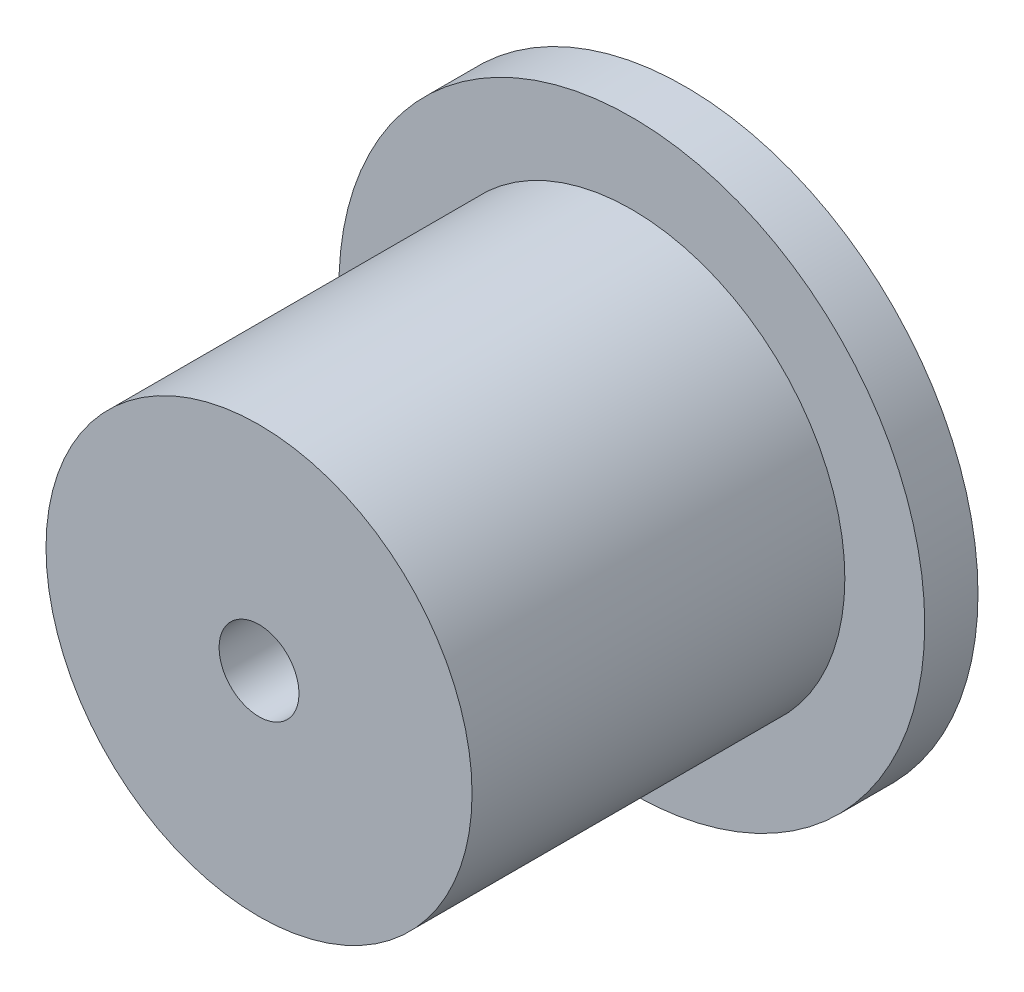
ISO-10303-21;
HEADER;
FILE_DESCRIPTION(('STEP AP214'),'2;1');
FILE_NAME('part.step','',(''),(''),'','','');
FILE_SCHEMA(('AUTOMOTIVE_DESIGN { 1 0 10303 214 1 1 1 1 }'));
ENDSEC;
DATA;
#1=APPLICATION_CONTEXT('core data for automotive mechanical design processes');
#2=APPLICATION_PROTOCOL_DEFINITION('international standard','automotive_design',2000,#1);
#3=PRODUCT_CONTEXT('',#1,'mechanical');
#4=PRODUCT('Part','Part','',(#3));
#5=PRODUCT_RELATED_PRODUCT_CATEGORY('part','',(#4));
#6=PRODUCT_DEFINITION_FORMATION('','',#4);
#7=PRODUCT_DEFINITION_CONTEXT('part definition',#1,'design');
#8=PRODUCT_DEFINITION('design','',#6,#7);
#9=PRODUCT_DEFINITION_SHAPE('','',#8);
#10=(LENGTH_UNIT() NAMED_UNIT(*) SI_UNIT(.MILLI.,.METRE.));
#11=(NAMED_UNIT(*) PLANE_ANGLE_UNIT() SI_UNIT($,.RADIAN.));
#12=(NAMED_UNIT(*) SI_UNIT($,.STERADIAN.) SOLID_ANGLE_UNIT());
#13=UNCERTAINTY_MEASURE_WITH_UNIT(LENGTH_MEASURE(1.E-05),#10,'distance_accuracy_value','');
#14=(GEOMETRIC_REPRESENTATION_CONTEXT(3) GLOBAL_UNCERTAINTY_ASSIGNED_CONTEXT((#13)) GLOBAL_UNIT_ASSIGNED_CONTEXT((#10,
#11,#12)) REPRESENTATION_CONTEXT('',''));
#15=CARTESIAN_POINT('',(0.,0.,0.));
#16=DIRECTION('',(0.,0.,1.));
#17=DIRECTION('',(1.,0.,0.));
#18=AXIS2_PLACEMENT_3D('',#15,#16,#17);
#19=CARTESIAN_POINT('',(0.,0.,2.));
#20=DIRECTION('',(0.,0.,-1.));
#21=DIRECTION('',(-1.,0.,0.));
#22=AXIS2_PLACEMENT_3D('',#19,#20,#21);
#23=CYLINDRICAL_SURFACE('',#22,11.);
#24=CARTESIAN_POINT('',(0.,0.,2.));
#25=DIRECTION('',(0.,0.,1.));
#26=DIRECTION('',(1.,0.,0.));
#27=AXIS2_PLACEMENT_3D('',#24,#25,#26);
#28=CIRCLE('',#27,11.);
#29=CARTESIAN_POINT('',(11.,0.,2.));
#30=VERTEX_POINT('',#29);
#31=EDGE_CURVE('E46',#30,#30,#28,.T.);
#32=ORIENTED_EDGE('',*,*,#31,.F.);
#33=EDGE_LOOP('',(#32));
#34=FACE_BOUND('',#33,.T.);
#35=CARTESIAN_POINT('',(0.,0.,0.));
#36=DIRECTION('',(0.,0.,1.));
#37=DIRECTION('',(1.,0.,0.));
#38=AXIS2_PLACEMENT_3D('',#35,#36,#37);
#39=CIRCLE('',#38,11.);
#40=CARTESIAN_POINT('',(11.,0.,0.));
#41=VERTEX_POINT('',#40);
#42=EDGE_CURVE('E42',#41,#41,#39,.T.);
#43=ORIENTED_EDGE('',*,*,#42,.T.);
#44=EDGE_LOOP('',(#43));
#45=FACE_BOUND('',#44,.T.);
#46=ADVANCED_FACE('F39',(#34,#45),#23,.T.);
#47=CARTESIAN_POINT('',(0.,0.,2.));
#48=DIRECTION('',(0.,0.,1.));
#49=DIRECTION('',(1.,0.,0.));
#50=AXIS2_PLACEMENT_3D('',#47,#48,#49);
#51=PLANE('',#50);
#52=CARTESIAN_POINT('',(0.,0.,2.));
#53=DIRECTION('',(0.,0.,1.));
#54=DIRECTION('',(1.,0.,0.));
#55=AXIS2_PLACEMENT_3D('',#52,#53,#54);
#56=CIRCLE('',#55,8.);
#57=CARTESIAN_POINT('',(8.,0.,2.));
#58=VERTEX_POINT('',#57);
#59=EDGE_CURVE('E10',#58,#58,#56,.T.);
#60=ORIENTED_EDGE('',*,*,#59,.F.);
#61=EDGE_LOOP('',(#60));
#62=FACE_BOUND('',#61,.T.);
#63=ORIENTED_EDGE('',*,*,#31,.T.);
#64=EDGE_LOOP('',(#63));
#65=FACE_BOUND('',#64,.T.);
#66=ADVANCED_FACE('F74',(#62,#65),#51,.T.);
#67=CARTESIAN_POINT('',(0.,0.,0.));
#68=DIRECTION('',(0.,0.,1.));
#69=DIRECTION('',(1.,0.,0.));
#70=AXIS2_PLACEMENT_3D('',#67,#68,#69);
#71=PLANE('',#70);
#72=CARTESIAN_POINT('',(0.,0.,0.));
#73=DIRECTION('',(0.,0.,-1.));
#74=DIRECTION('',(-1.,0.,0.));
#75=AXIS2_PLACEMENT_3D('',#72,#73,#74);
#76=CIRCLE('',#75,3.);
#77=CARTESIAN_POINT('',(-3.,0.,0.));
#78=VERTEX_POINT('',#77);
#79=EDGE_CURVE('E64',#78,#78,#76,.T.);
#80=ORIENTED_EDGE('',*,*,#79,.F.);
#81=EDGE_LOOP('',(#80));
#82=FACE_BOUND('',#81,.T.);
#83=ORIENTED_EDGE('',*,*,#42,.F.);
#84=EDGE_LOOP('',(#83));
#85=FACE_BOUND('',#84,.T.);
#86=ADVANCED_FACE('F70',(#82,#85),#71,.F.);
#87=CARTESIAN_POINT('',(0.,0.,16.));
#88=DIRECTION('',(0.,0.,-1.));
#89=DIRECTION('',(-1.,0.,0.));
#90=AXIS2_PLACEMENT_3D('',#87,#88,#89);
#91=CYLINDRICAL_SURFACE('',#90,8.);
#92=CARTESIAN_POINT('',(0.,0.,16.));
#93=DIRECTION('',(0.,0.,1.));
#94=DIRECTION('',(1.,0.,0.));
#95=AXIS2_PLACEMENT_3D('',#92,#93,#94);
#96=CIRCLE('',#95,8.);
#97=CARTESIAN_POINT('',(8.,0.,16.));
#98=VERTEX_POINT('',#97);
#99=EDGE_CURVE('E52',#98,#98,#96,.T.);
#100=ORIENTED_EDGE('',*,*,#99,.F.);
#101=EDGE_LOOP('',(#100));
#102=FACE_BOUND('',#101,.T.);
#103=ORIENTED_EDGE('',*,*,#59,.T.);
#104=EDGE_LOOP('',(#103));
#105=FACE_BOUND('',#104,.T.);
#106=ADVANCED_FACE('F73',(#102,#105),#91,.T.);
#107=CARTESIAN_POINT('',(0.,0.,16.));
#108=DIRECTION('',(0.,0.,1.));
#109=DIRECTION('',(1.,0.,0.));
#110=AXIS2_PLACEMENT_3D('',#107,#108,#109);
#111=PLANE('',#110);
#112=CARTESIAN_POINT('',(0.,0.,16.));
#113=DIRECTION('',(0.,0.,-1.));
#114=DIRECTION('',(-1.,0.,0.));
#115=AXIS2_PLACEMENT_3D('',#112,#113,#114);
#116=CIRCLE('',#115,1.5);
#117=CARTESIAN_POINT('',(-1.5,0.,16.));
#118=VERTEX_POINT('',#117);
#119=EDGE_CURVE('E55',#118,#118,#116,.T.);
#120=ORIENTED_EDGE('',*,*,#119,.T.);
#121=EDGE_LOOP('',(#120));
#122=FACE_BOUND('',#121,.T.);
#123=ORIENTED_EDGE('',*,*,#99,.T.);
#124=EDGE_LOOP('',(#123));
#125=FACE_BOUND('',#124,.T.);
#126=ADVANCED_FACE('F92',(#122,#125),#111,.T.);
#127=CARTESIAN_POINT('',(0.,0.,0.));
#128=DIRECTION('',(0.,0.,-1.));
#129=DIRECTION('',(-1.,0.,0.));
#130=AXIS2_PLACEMENT_3D('',#127,#128,#129);
#131=CYLINDRICAL_SURFACE('',#130,1.5);
#132=ORIENTED_EDGE('',*,*,#119,.F.);
#133=EDGE_LOOP('',(#132));
#134=FACE_BOUND('',#133,.T.);
#135=CARTESIAN_POINT('',(0.,0.,3.));
#136=DIRECTION('',(0.,0.,-1.));
#137=DIRECTION('',(-1.,0.,0.));
#138=AXIS2_PLACEMENT_3D('',#135,#136,#137);
#139=CIRCLE('',#138,1.5);
#140=CARTESIAN_POINT('',(-1.5,0.,3.));
#141=VERTEX_POINT('',#140);
#142=EDGE_CURVE('E58',#141,#141,#139,.T.);
#143=ORIENTED_EDGE('',*,*,#142,.T.);
#144=EDGE_LOOP('',(#143));
#145=FACE_BOUND('',#144,.T.);
#146=ADVANCED_FACE('F96',(#134,#145),#131,.F.);
#147=CARTESIAN_POINT('',(1.5,0.,3.));
#148=DIRECTION('',(0.,0.,1.));
#149=DIRECTION('',(1.,0.,0.));
#150=AXIS2_PLACEMENT_3D('',#147,#148,#149);
#151=PLANE('',#150);
#152=ORIENTED_EDGE('',*,*,#142,.F.);
#153=EDGE_LOOP('',(#152));
#154=FACE_BOUND('',#153,.T.);
#155=CARTESIAN_POINT('',(0.,0.,3.));
#156=DIRECTION('',(0.,0.,-1.));
#157=DIRECTION('',(-1.,0.,0.));
#158=AXIS2_PLACEMENT_3D('',#155,#156,#157);
#159=CIRCLE('',#158,3.);
#160=CARTESIAN_POINT('',(-3.,0.,3.));
#161=VERTEX_POINT('',#160);
#162=EDGE_CURVE('E61',#161,#161,#159,.T.);
#163=ORIENTED_EDGE('',*,*,#162,.T.);
#164=EDGE_LOOP('',(#163));
#165=FACE_BOUND('',#164,.T.);
#166=ADVANCED_FACE('F100',(#154,#165),#151,.F.);
#167=CARTESIAN_POINT('',(0.,0.,0.));
#168=DIRECTION('',(0.,0.,-1.));
#169=DIRECTION('',(-1.,0.,0.));
#170=AXIS2_PLACEMENT_3D('',#167,#168,#169);
#171=CYLINDRICAL_SURFACE('',#170,3.);
#172=ORIENTED_EDGE('',*,*,#162,.F.);
#173=EDGE_LOOP('',(#172));
#174=FACE_BOUND('',#173,.T.);
#175=ORIENTED_EDGE('',*,*,#79,.T.);
#176=EDGE_LOOP('',(#175));
#177=FACE_BOUND('',#176,.T.);
#178=ADVANCED_FACE('F68',(#174,#177),#171,.F.);
#179=CLOSED_SHELL('',(#46,#66,#86,#106,#126,#146,#166,#178));
#180=MANIFOLD_SOLID_BREP('B2',#179);
#181=ADVANCED_BREP_SHAPE_REPRESENTATION('',(#18,#180),#14);
#182=SHAPE_DEFINITION_REPRESENTATION(#9,#181);
ENDSEC;
END-ISO-10303-21;
